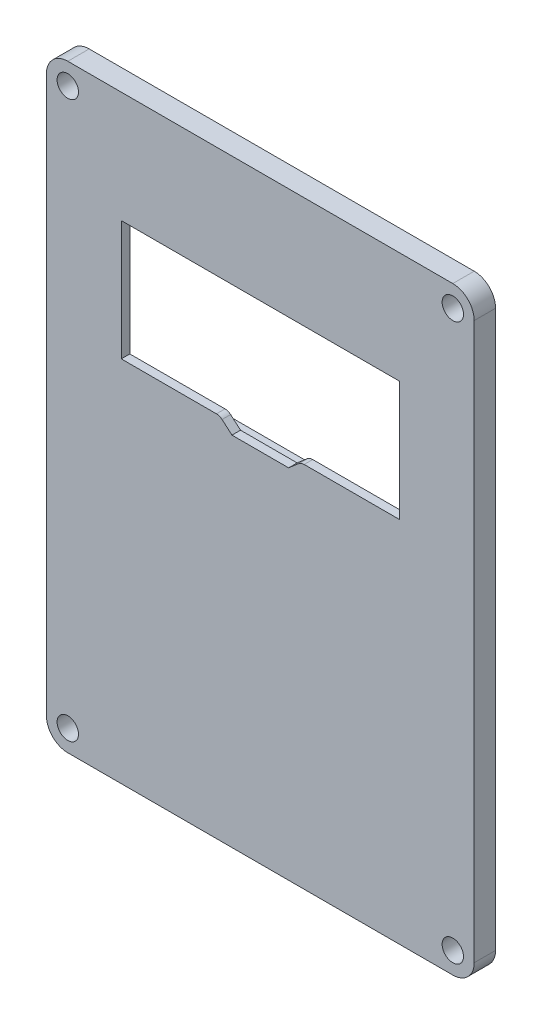
ISO-10303-21;
HEADER;
FILE_DESCRIPTION(('STEP AP214'),'2;1');
FILE_NAME('part.step','',(''),(''),'','','');
FILE_SCHEMA(('AUTOMOTIVE_DESIGN { 1 0 10303 214 1 1 1 1 }'));
ENDSEC;
DATA;
#1=APPLICATION_CONTEXT('core data for automotive mechanical design processes');
#2=APPLICATION_PROTOCOL_DEFINITION('international standard','automotive_design',2000,#1);
#3=PRODUCT_CONTEXT('',#1,'mechanical');
#4=PRODUCT('Part','Part','',(#3));
#5=PRODUCT_RELATED_PRODUCT_CATEGORY('part','',(#4));
#6=PRODUCT_DEFINITION_FORMATION('','',#4);
#7=PRODUCT_DEFINITION_CONTEXT('part definition',#1,'design');
#8=PRODUCT_DEFINITION('design','',#6,#7);
#9=PRODUCT_DEFINITION_SHAPE('','',#8);
#10=(LENGTH_UNIT() NAMED_UNIT(*) SI_UNIT(.MILLI.,.METRE.));
#11=(NAMED_UNIT(*) PLANE_ANGLE_UNIT() SI_UNIT($,.RADIAN.));
#12=(NAMED_UNIT(*) SI_UNIT($,.STERADIAN.) SOLID_ANGLE_UNIT());
#13=UNCERTAINTY_MEASURE_WITH_UNIT(LENGTH_MEASURE(1.E-05),#10,'distance_accuracy_value','');
#14=(GEOMETRIC_REPRESENTATION_CONTEXT(3) GLOBAL_UNCERTAINTY_ASSIGNED_CONTEXT((#13)) GLOBAL_UNIT_ASSIGNED_CONTEXT((#10,
#11,#12)) REPRESENTATION_CONTEXT('',''));
#15=CARTESIAN_POINT('',(0.,0.,0.));
#16=DIRECTION('',(0.,0.,1.));
#17=DIRECTION('',(1.,0.,0.));
#18=AXIS2_PLACEMENT_3D('',#15,#16,#17);
#19=CARTESIAN_POINT('',(0.,0.,5.));
#20=DIRECTION('',(0.,0.,1.));
#21=DIRECTION('',(1.,0.,0.));
#22=AXIS2_PLACEMENT_3D('',#19,#20,#21);
#23=PLANE('',#22);
#24=CARTESIAN_POINT('',(-45.,-65.,5.));
#25=DIRECTION('',(0.,0.,1.));
#26=DIRECTION('',(1.,0.,0.));
#27=AXIS2_PLACEMENT_3D('',#24,#25,#26);
#28=CIRCLE('',#27,2.5);
#29=CARTESIAN_POINT('',(-42.5,-65.,5.));
#30=VERTEX_POINT('',#29);
#31=EDGE_CURVE('E218',#30,#30,#28,.T.);
#32=ORIENTED_EDGE('',*,*,#31,.F.);
#33=EDGE_LOOP('',(#32));
#34=FACE_BOUND('',#33,.T.);
#35=CARTESIAN_POINT('',(45.,-65.,5.));
#36=DIRECTION('',(0.,0.,1.));
#37=DIRECTION('',(1.,0.,0.));
#38=AXIS2_PLACEMENT_3D('',#35,#36,#37);
#39=CIRCLE('',#38,2.5);
#40=CARTESIAN_POINT('',(47.5,-65.,5.));
#41=VERTEX_POINT('',#40);
#42=EDGE_CURVE('E221',#41,#41,#39,.T.);
#43=ORIENTED_EDGE('',*,*,#42,.F.);
#44=EDGE_LOOP('',(#43));
#45=FACE_BOUND('',#44,.T.);
#46=CARTESIAN_POINT('',(45.,65.,5.));
#47=DIRECTION('',(0.,0.,1.));
#48=DIRECTION('',(1.,0.,0.));
#49=AXIS2_PLACEMENT_3D('',#46,#47,#48);
#50=CIRCLE('',#49,2.5);
#51=CARTESIAN_POINT('',(47.5,65.,5.));
#52=VERTEX_POINT('',#51);
#53=EDGE_CURVE('E225',#52,#52,#50,.T.);
#54=ORIENTED_EDGE('',*,*,#53,.F.);
#55=EDGE_LOOP('',(#54));
#56=FACE_BOUND('',#55,.T.);
#57=CARTESIAN_POINT('',(-45.,65.,5.));
#58=DIRECTION('',(0.,0.,1.));
#59=DIRECTION('',(1.,0.,0.));
#60=AXIS2_PLACEMENT_3D('',#57,#58,#59);
#61=CIRCLE('',#60,2.5);
#62=CARTESIAN_POINT('',(-42.5,65.,5.));
#63=VERTEX_POINT('',#62);
#64=EDGE_CURVE('E228',#63,#63,#61,.T.);
#65=ORIENTED_EDGE('',*,*,#64,.F.);
#66=EDGE_LOOP('',(#65));
#67=FACE_BOUND('',#66,.T.);
#68=DIRECTION('',(1.,0.,0.));
#69=VECTOR('',#68,1.);
#70=CARTESIAN_POINT('',(0.,70.,5.));
#71=LINE('',#70,#69);
#72=CARTESIAN_POINT('',(-45.,70.,5.));
#73=VERTEX_POINT('',#72);
#74=CARTESIAN_POINT('',(45.,70.,5.));
#75=VERTEX_POINT('',#74);
#76=EDGE_CURVE('E231',#73,#75,#71,.T.);
#77=ORIENTED_EDGE('',*,*,#76,.F.);
#78=CARTESIAN_POINT('',(-45.,65.,5.));
#79=DIRECTION('',(0.,0.,1.));
#80=DIRECTION('',(1.,0.,0.));
#81=AXIS2_PLACEMENT_3D('',#78,#79,#80);
#82=CIRCLE('',#81,5.00000000000001);
#83=CARTESIAN_POINT('',(-50.,65.,5.));
#84=VERTEX_POINT('',#83);
#85=EDGE_CURVE('E234',#73,#84,#82,.T.);
#86=ORIENTED_EDGE('',*,*,#85,.T.);
#87=DIRECTION('',(0.,-1.,0.));
#88=VECTOR('',#87,1.);
#89=CARTESIAN_POINT('',(-50.,0.,5.));
#90=LINE('',#89,#88);
#91=CARTESIAN_POINT('',(-50.,-65.,5.));
#92=VERTEX_POINT('',#91);
#93=EDGE_CURVE('E237',#84,#92,#90,.T.);
#94=ORIENTED_EDGE('',*,*,#93,.T.);
#95=CARTESIAN_POINT('',(-45.,-65.,5.));
#96=DIRECTION('',(0.,0.,1.));
#97=DIRECTION('',(1.,0.,0.));
#98=AXIS2_PLACEMENT_3D('',#95,#96,#97);
#99=CIRCLE('',#98,5.);
#100=CARTESIAN_POINT('',(-45.,-70.,5.));
#101=VERTEX_POINT('',#100);
#102=EDGE_CURVE('E240',#92,#101,#99,.T.);
#103=ORIENTED_EDGE('',*,*,#102,.T.);
#104=DIRECTION('',(1.,0.,0.));
#105=VECTOR('',#104,1.);
#106=CARTESIAN_POINT('',(0.,-70.,5.));
#107=LINE('',#106,#105);
#108=CARTESIAN_POINT('',(45.,-70.,5.));
#109=VERTEX_POINT('',#108);
#110=EDGE_CURVE('E243',#101,#109,#107,.T.);
#111=ORIENTED_EDGE('',*,*,#110,.T.);
#112=CARTESIAN_POINT('',(45.,-65.,5.));
#113=DIRECTION('',(0.,0.,1.));
#114=DIRECTION('',(1.,0.,0.));
#115=AXIS2_PLACEMENT_3D('',#112,#113,#114);
#116=CIRCLE('',#115,4.99999999999999);
#117=CARTESIAN_POINT('',(50.,-65.,5.));
#118=VERTEX_POINT('',#117);
#119=EDGE_CURVE('E246',#109,#118,#116,.T.);
#120=ORIENTED_EDGE('',*,*,#119,.T.);
#121=DIRECTION('',(0.,-1.,0.));
#122=VECTOR('',#121,1.);
#123=CARTESIAN_POINT('',(50.,0.,5.));
#124=LINE('',#123,#122);
#125=CARTESIAN_POINT('',(50.,65.,5.));
#126=VERTEX_POINT('',#125);
#127=EDGE_CURVE('E248',#126,#118,#124,.T.);
#128=ORIENTED_EDGE('',*,*,#127,.F.);
#129=CARTESIAN_POINT('',(45.,65.,5.));
#130=DIRECTION('',(0.,0.,1.));
#131=DIRECTION('',(1.,0.,0.));
#132=AXIS2_PLACEMENT_3D('',#129,#130,#131);
#133=CIRCLE('',#132,5.);
#134=EDGE_CURVE('E251',#75,#126,#133,.F.);
#135=ORIENTED_EDGE('',*,*,#134,.F.);
#136=EDGE_LOOP('',(#77,#86,#94,#103,#111,#120,#128,#135));
#137=FACE_BOUND('',#136,.T.);
#138=DIRECTION('',(0.754953355153231,-0.655778492741932,0.));
#139=VECTOR('',#138,1.);
#140=CARTESIAN_POINT('',(3.83588317366824,4.41599244865184,5.));
#141=LINE('',#140,#139);
#142=CARTESIAN_POINT('',(-8.93578879532143,15.5099067103065,5.));
#143=VERTEX_POINT('',#142);
#144=CARTESIAN_POINT('',(-6.6219193542143,13.5,5.));
#145=VERTEX_POINT('',#144);
#146=EDGE_CURVE('E217',#143,#145,#141,.T.);
#147=ORIENTED_EDGE('',*,*,#146,.F.);
#148=CARTESIAN_POINT('',(-10.2473457808053,14.,5.));
#149=DIRECTION('',(0.,0.,-1.));
#150=DIRECTION('',(-1.,0.,0.));
#151=AXIS2_PLACEMENT_3D('',#148,#149,#150);
#152=CIRCLE('',#151,2.);
#153=CARTESIAN_POINT('',(-10.2473457808053,16.,5.));
#154=VERTEX_POINT('',#153);
#155=EDGE_CURVE('E346',#154,#143,#152,.T.);
#156=ORIENTED_EDGE('',*,*,#155,.F.);
#157=DIRECTION('',(1.,0.,0.));
#158=VECTOR('',#157,1.);
#159=CARTESIAN_POINT('',(0.,16.,5.));
#160=LINE('',#159,#158);
#161=CARTESIAN_POINT('',(-32.5,16.,5.));
#162=VERTEX_POINT('',#161);
#163=EDGE_CURVE('E434',#162,#154,#160,.T.);
#164=ORIENTED_EDGE('',*,*,#163,.F.);
#165=DIRECTION('',(0.,1.,0.));
#166=VECTOR('',#165,1.);
#167=CARTESIAN_POINT('',(-32.5,0.,5.));
#168=LINE('',#167,#166);
#169=CARTESIAN_POINT('',(-32.5,44.,5.));
#170=VERTEX_POINT('',#169);
#171=EDGE_CURVE('E436',#162,#170,#168,.T.);
#172=ORIENTED_EDGE('',*,*,#171,.T.);
#173=DIRECTION('',(-1.,0.,0.));
#174=VECTOR('',#173,1.);
#175=CARTESIAN_POINT('',(0.,44.,5.));
#176=LINE('',#175,#174);
#177=CARTESIAN_POINT('',(32.5,44.,5.));
#178=VERTEX_POINT('',#177);
#179=EDGE_CURVE('E206',#178,#170,#176,.T.);
#180=ORIENTED_EDGE('',*,*,#179,.F.);
#181=DIRECTION('',(0.,1.,0.));
#182=VECTOR('',#181,1.);
#183=CARTESIAN_POINT('',(32.5,0.,5.));
#184=LINE('',#183,#182);
#185=CARTESIAN_POINT('',(32.5,16.,5.));
#186=VERTEX_POINT('',#185);
#187=EDGE_CURVE('E382',#186,#178,#184,.T.);
#188=ORIENTED_EDGE('',*,*,#187,.F.);
#189=DIRECTION('',(-1.,0.,0.));
#190=VECTOR('',#189,1.);
#191=CARTESIAN_POINT('',(0.,16.,5.));
#192=LINE('',#191,#190);
#193=CARTESIAN_POINT('',(10.2473457808053,16.,5.));
#194=VERTEX_POINT('',#193);
#195=EDGE_CURVE('E378',#186,#194,#192,.T.);
#196=ORIENTED_EDGE('',*,*,#195,.T.);
#197=CARTESIAN_POINT('',(10.2473457808053,14.,5.));
#198=DIRECTION('',(0.,0.,-1.));
#199=DIRECTION('',(-1.,0.,0.));
#200=AXIS2_PLACEMENT_3D('',#197,#198,#199);
#201=CIRCLE('',#200,2.);
#202=CARTESIAN_POINT('',(8.93578879532143,15.5099067103065,5.));
#203=VERTEX_POINT('',#202);
#204=EDGE_CURVE('E441',#194,#203,#201,.F.);
#205=ORIENTED_EDGE('',*,*,#204,.T.);
#206=DIRECTION('',(-0.754953355153231,-0.655778492741932,0.));
#207=VECTOR('',#206,1.);
#208=CARTESIAN_POINT('',(-3.83588317366824,4.41599244865184,5.));
#209=LINE('',#208,#207);
#210=CARTESIAN_POINT('',(6.6219193542143,13.5,5.));
#211=VERTEX_POINT('',#210);
#212=EDGE_CURVE('E355',#203,#211,#209,.T.);
#213=ORIENTED_EDGE('',*,*,#212,.T.);
#214=DIRECTION('',(-1.,0.,0.));
#215=VECTOR('',#214,1.);
#216=CARTESIAN_POINT('',(0.,13.5,5.));
#217=LINE('',#216,#215);
#218=EDGE_CURVE('E349',#211,#145,#217,.T.);
#219=ORIENTED_EDGE('',*,*,#218,.T.);
#220=EDGE_LOOP('',(#147,#156,#164,#172,#180,#188,#196,#205,#213,#219));
#221=FACE_BOUND('',#220,.T.);
#222=ADVANCED_FACE('F39',(#34,#45,#56,#67,#137,#221),#23,.T.);
#223=CARTESIAN_POINT('',(0.,0.,0.));
#224=DIRECTION('',(0.,0.,1.));
#225=DIRECTION('',(1.,0.,0.));
#226=AXIS2_PLACEMENT_3D('',#223,#224,#225);
#227=PLANE('',#226);
#228=DIRECTION('',(1.,0.,0.));
#229=VECTOR('',#228,1.);
#230=CARTESIAN_POINT('',(38.,48.,0.));
#231=LINE('',#230,#229);
#232=CARTESIAN_POINT('',(-38.,48.,0.));
#233=VERTEX_POINT('',#232);
#234=CARTESIAN_POINT('',(38.,48.,0.));
#235=VERTEX_POINT('',#234);
#236=EDGE_CURVE('E418',#233,#235,#231,.T.);
#237=ORIENTED_EDGE('',*,*,#236,.F.);
#238=DIRECTION('',(0.,1.,0.));
#239=VECTOR('',#238,1.);
#240=CARTESIAN_POINT('',(-38.,12.,0.));
#241=LINE('',#240,#239);
#242=CARTESIAN_POINT('',(-38.,12.,0.));
#243=VERTEX_POINT('',#242);
#244=EDGE_CURVE('E54',#243,#233,#241,.T.);
#245=ORIENTED_EDGE('',*,*,#244,.F.);
#246=DIRECTION('',(-1.,0.,0.));
#247=VECTOR('',#246,1.);
#248=CARTESIAN_POINT('',(38.,12.,0.));
#249=LINE('',#248,#247);
#250=CARTESIAN_POINT('',(38.,12.,0.));
#251=VERTEX_POINT('',#250);
#252=EDGE_CURVE('E407',#251,#243,#249,.T.);
#253=ORIENTED_EDGE('',*,*,#252,.F.);
#254=DIRECTION('',(0.,-1.,0.));
#255=VECTOR('',#254,1.);
#256=CARTESIAN_POINT('',(38.,12.,0.));
#257=LINE('',#256,#255);
#258=EDGE_CURVE('E421',#235,#251,#257,.T.);
#259=ORIENTED_EDGE('',*,*,#258,.F.);
#260=EDGE_LOOP('',(#237,#245,#253,#259));
#261=FACE_BOUND('',#260,.T.);
#262=DIRECTION('',(1.,0.,0.));
#263=VECTOR('',#262,1.);
#264=CARTESIAN_POINT('',(0.,70.,0.));
#265=LINE('',#264,#263);
#266=CARTESIAN_POINT('',(-45.,70.,0.));
#267=VERTEX_POINT('',#266);
#268=CARTESIAN_POINT('',(45.,70.,0.));
#269=VERTEX_POINT('',#268);
#270=EDGE_CURVE('E268',#267,#269,#265,.T.);
#271=ORIENTED_EDGE('',*,*,#270,.T.);
#272=CARTESIAN_POINT('',(45.,65.,0.));
#273=DIRECTION('',(0.,0.,1.));
#274=DIRECTION('',(1.,0.,0.));
#275=AXIS2_PLACEMENT_3D('',#272,#273,#274);
#276=CIRCLE('',#275,5.);
#277=CARTESIAN_POINT('',(50.,65.,0.));
#278=VERTEX_POINT('',#277);
#279=EDGE_CURVE('E222',#269,#278,#276,.F.);
#280=ORIENTED_EDGE('',*,*,#279,.T.);
#281=DIRECTION('',(0.,-1.,0.));
#282=VECTOR('',#281,1.);
#283=CARTESIAN_POINT('',(50.,0.,0.));
#284=LINE('',#283,#282);
#285=CARTESIAN_POINT('',(50.,-65.,0.));
#286=VERTEX_POINT('',#285);
#287=EDGE_CURVE('E286',#278,#286,#284,.T.);
#288=ORIENTED_EDGE('',*,*,#287,.T.);
#289=CARTESIAN_POINT('',(45.,-65.,0.));
#290=DIRECTION('',(0.,0.,1.));
#291=DIRECTION('',(1.,0.,0.));
#292=AXIS2_PLACEMENT_3D('',#289,#290,#291);
#293=CIRCLE('',#292,4.99999999999999);
#294=CARTESIAN_POINT('',(45.,-70.,0.));
#295=VERTEX_POINT('',#294);
#296=EDGE_CURVE('E283',#295,#286,#293,.T.);
#297=ORIENTED_EDGE('',*,*,#296,.F.);
#298=DIRECTION('',(1.,0.,0.));
#299=VECTOR('',#298,1.);
#300=CARTESIAN_POINT('',(0.,-70.,0.));
#301=LINE('',#300,#299);
#302=CARTESIAN_POINT('',(-45.,-70.,0.));
#303=VERTEX_POINT('',#302);
#304=EDGE_CURVE('E280',#303,#295,#301,.T.);
#305=ORIENTED_EDGE('',*,*,#304,.F.);
#306=CARTESIAN_POINT('',(-45.,-65.,0.));
#307=DIRECTION('',(0.,0.,1.));
#308=DIRECTION('',(1.,0.,0.));
#309=AXIS2_PLACEMENT_3D('',#306,#307,#308);
#310=CIRCLE('',#309,5.);
#311=CARTESIAN_POINT('',(-50.,-65.,0.));
#312=VERTEX_POINT('',#311);
#313=EDGE_CURVE('E277',#312,#303,#310,.T.);
#314=ORIENTED_EDGE('',*,*,#313,.F.);
#315=DIRECTION('',(0.,-1.,0.));
#316=VECTOR('',#315,1.);
#317=CARTESIAN_POINT('',(-50.,0.,0.));
#318=LINE('',#317,#316);
#319=CARTESIAN_POINT('',(-50.,65.,0.));
#320=VERTEX_POINT('',#319);
#321=EDGE_CURVE('E274',#320,#312,#318,.T.);
#322=ORIENTED_EDGE('',*,*,#321,.F.);
#323=CARTESIAN_POINT('',(-45.,65.,0.));
#324=DIRECTION('',(0.,0.,1.));
#325=DIRECTION('',(1.,0.,0.));
#326=AXIS2_PLACEMENT_3D('',#323,#324,#325);
#327=CIRCLE('',#326,5.00000000000001);
#328=EDGE_CURVE('E271',#267,#320,#327,.T.);
#329=ORIENTED_EDGE('',*,*,#328,.F.);
#330=EDGE_LOOP('',(#271,#280,#288,#297,#305,#314,#322,#329));
#331=FACE_BOUND('',#330,.T.);
#332=CARTESIAN_POINT('',(-45.,65.,0.));
#333=DIRECTION('',(0.,0.,1.));
#334=DIRECTION('',(1.,0.,0.));
#335=AXIS2_PLACEMENT_3D('',#332,#333,#334);
#336=CIRCLE('',#335,2.5);
#337=CARTESIAN_POINT('',(-42.5,65.,0.));
#338=VERTEX_POINT('',#337);
#339=EDGE_CURVE('E265',#338,#338,#336,.T.);
#340=ORIENTED_EDGE('',*,*,#339,.T.);
#341=EDGE_LOOP('',(#340));
#342=FACE_BOUND('',#341,.T.);
#343=CARTESIAN_POINT('',(45.,65.,0.));
#344=DIRECTION('',(0.,0.,1.));
#345=DIRECTION('',(1.,0.,0.));
#346=AXIS2_PLACEMENT_3D('',#343,#344,#345);
#347=CIRCLE('',#346,2.5);
#348=CARTESIAN_POINT('',(47.5,65.,0.));
#349=VERTEX_POINT('',#348);
#350=EDGE_CURVE('E262',#349,#349,#347,.T.);
#351=ORIENTED_EDGE('',*,*,#350,.T.);
#352=EDGE_LOOP('',(#351));
#353=FACE_BOUND('',#352,.T.);
#354=CARTESIAN_POINT('',(45.,-65.,0.));
#355=DIRECTION('',(0.,0.,1.));
#356=DIRECTION('',(1.,0.,0.));
#357=AXIS2_PLACEMENT_3D('',#354,#355,#356);
#358=CIRCLE('',#357,2.5);
#359=CARTESIAN_POINT('',(47.5,-65.,0.));
#360=VERTEX_POINT('',#359);
#361=EDGE_CURVE('E258',#360,#360,#358,.T.);
#362=ORIENTED_EDGE('',*,*,#361,.T.);
#363=EDGE_LOOP('',(#362));
#364=FACE_BOUND('',#363,.T.);
#365=CARTESIAN_POINT('',(-45.,-65.,0.));
#366=DIRECTION('',(0.,0.,1.));
#367=DIRECTION('',(1.,0.,0.));
#368=AXIS2_PLACEMENT_3D('',#365,#366,#367);
#369=CIRCLE('',#368,2.5);
#370=CARTESIAN_POINT('',(-42.5,-65.,0.));
#371=VERTEX_POINT('',#370);
#372=EDGE_CURVE('E255',#371,#371,#369,.T.);
#373=ORIENTED_EDGE('',*,*,#372,.T.);
#374=EDGE_LOOP('',(#373));
#375=FACE_BOUND('',#374,.T.);
#376=ADVANCED_FACE('F315',(#261,#331,#342,#353,#364,#375),#227,.F.);
#377=CARTESIAN_POINT('',(0.,70.,5.));
#378=DIRECTION('',(0.,1.,0.));
#379=DIRECTION('',(0.,0.,1.));
#380=AXIS2_PLACEMENT_3D('',#377,#378,#379);
#381=PLANE('',#380);
#382=ORIENTED_EDGE('',*,*,#270,.F.);
#383=DIRECTION('',(0.,0.,-1.));
#384=VECTOR('',#383,1.);
#385=CARTESIAN_POINT('',(-45.,70.,5.));
#386=LINE('',#385,#384);
#387=EDGE_CURVE('E11',#73,#267,#386,.T.);
#388=ORIENTED_EDGE('',*,*,#387,.F.);
#389=ORIENTED_EDGE('',*,*,#76,.T.);
#390=DIRECTION('',(0.,0.,-1.));
#391=VECTOR('',#390,1.);
#392=CARTESIAN_POINT('',(45.,70.,5.));
#393=LINE('',#392,#391);
#394=EDGE_CURVE('E254',#75,#269,#393,.T.);
#395=ORIENTED_EDGE('',*,*,#394,.T.);
#396=EDGE_LOOP('',(#382,#388,#389,#395));
#397=FACE_BOUND('',#396,.T.);
#398=ADVANCED_FACE('F319',(#397),#381,.T.);
#399=CARTESIAN_POINT('',(-45.,65.,5.));
#400=DIRECTION('',(0.,0.,-1.));
#401=DIRECTION('',(-1.,0.,0.));
#402=AXIS2_PLACEMENT_3D('',#399,#400,#401);
#403=CYLINDRICAL_SURFACE('',#402,5.00000000000001);
#404=ORIENTED_EDGE('',*,*,#328,.T.);
#405=DIRECTION('',(0.,0.,-1.));
#406=VECTOR('',#405,1.);
#407=CARTESIAN_POINT('',(-50.,65.,5.));
#408=LINE('',#407,#406);
#409=EDGE_CURVE('E47',#84,#320,#408,.T.);
#410=ORIENTED_EDGE('',*,*,#409,.F.);
#411=ORIENTED_EDGE('',*,*,#85,.F.);
#412=ORIENTED_EDGE('',*,*,#387,.T.);
#413=EDGE_LOOP('',(#404,#410,#411,#412));
#414=FACE_BOUND('',#413,.T.);
#415=ADVANCED_FACE('F312',(#414),#403,.T.);
#416=CARTESIAN_POINT('',(-50.,0.,5.));
#417=DIRECTION('',(1.,0.,0.));
#418=DIRECTION('',(0.,1.,0.));
#419=AXIS2_PLACEMENT_3D('',#416,#417,#418);
#420=PLANE('',#419);
#421=ORIENTED_EDGE('',*,*,#321,.T.);
#422=DIRECTION('',(0.,0.,-1.));
#423=VECTOR('',#422,1.);
#424=CARTESIAN_POINT('',(-50.,-65.,5.));
#425=LINE('',#424,#423);
#426=EDGE_CURVE('E302',#92,#312,#425,.T.);
#427=ORIENTED_EDGE('',*,*,#426,.F.);
#428=ORIENTED_EDGE('',*,*,#93,.F.);
#429=ORIENTED_EDGE('',*,*,#409,.T.);
#430=EDGE_LOOP('',(#421,#427,#428,#429));
#431=FACE_BOUND('',#430,.T.);
#432=ADVANCED_FACE('F307',(#431),#420,.F.);
#433=CARTESIAN_POINT('',(-45.,-65.,5.));
#434=DIRECTION('',(0.,0.,-1.));
#435=DIRECTION('',(-1.,0.,0.));
#436=AXIS2_PLACEMENT_3D('',#433,#434,#435);
#437=CYLINDRICAL_SURFACE('',#436,5.);
#438=ORIENTED_EDGE('',*,*,#313,.T.);
#439=DIRECTION('',(0.,0.,-1.));
#440=VECTOR('',#439,1.);
#441=CARTESIAN_POINT('',(-45.,-70.,5.));
#442=LINE('',#441,#440);
#443=EDGE_CURVE('E299',#101,#303,#442,.T.);
#444=ORIENTED_EDGE('',*,*,#443,.F.);
#445=ORIENTED_EDGE('',*,*,#102,.F.);
#446=ORIENTED_EDGE('',*,*,#426,.T.);
#447=EDGE_LOOP('',(#438,#444,#445,#446));
#448=FACE_BOUND('',#447,.T.);
#449=ADVANCED_FACE('F336',(#448),#437,.T.);
#450=CARTESIAN_POINT('',(0.,-70.,5.));
#451=DIRECTION('',(0.,1.,0.));
#452=DIRECTION('',(0.,0.,1.));
#453=AXIS2_PLACEMENT_3D('',#450,#451,#452);
#454=PLANE('',#453);
#455=ORIENTED_EDGE('',*,*,#304,.T.);
#456=DIRECTION('',(0.,0.,-1.));
#457=VECTOR('',#456,1.);
#458=CARTESIAN_POINT('',(45.,-70.,5.));
#459=LINE('',#458,#457);
#460=EDGE_CURVE('E296',#109,#295,#459,.T.);
#461=ORIENTED_EDGE('',*,*,#460,.F.);
#462=ORIENTED_EDGE('',*,*,#110,.F.);
#463=ORIENTED_EDGE('',*,*,#443,.T.);
#464=EDGE_LOOP('',(#455,#461,#462,#463));
#465=FACE_BOUND('',#464,.T.);
#466=ADVANCED_FACE('F333',(#465),#454,.F.);
#467=CARTESIAN_POINT('',(45.,-65.,5.));
#468=DIRECTION('',(0.,0.,-1.));
#469=DIRECTION('',(-1.,0.,0.));
#470=AXIS2_PLACEMENT_3D('',#467,#468,#469);
#471=CYLINDRICAL_SURFACE('',#470,4.99999999999999);
#472=ORIENTED_EDGE('',*,*,#296,.T.);
#473=DIRECTION('',(0.,0.,-1.));
#474=VECTOR('',#473,1.);
#475=CARTESIAN_POINT('',(50.,-65.,5.));
#476=LINE('',#475,#474);
#477=EDGE_CURVE('E294',#118,#286,#476,.T.);
#478=ORIENTED_EDGE('',*,*,#477,.F.);
#479=ORIENTED_EDGE('',*,*,#119,.F.);
#480=ORIENTED_EDGE('',*,*,#460,.T.);
#481=EDGE_LOOP('',(#472,#478,#479,#480));
#482=FACE_BOUND('',#481,.T.);
#483=ADVANCED_FACE('F330',(#482),#471,.T.);
#484=CARTESIAN_POINT('',(50.,0.,5.));
#485=DIRECTION('',(1.,0.,0.));
#486=DIRECTION('',(0.,1.,0.));
#487=AXIS2_PLACEMENT_3D('',#484,#485,#486);
#488=PLANE('',#487);
#489=ORIENTED_EDGE('',*,*,#287,.F.);
#490=DIRECTION('',(0.,0.,-1.));
#491=VECTOR('',#490,1.);
#492=CARTESIAN_POINT('',(50.,65.,5.));
#493=LINE('',#492,#491);
#494=EDGE_CURVE('E292',#126,#278,#493,.T.);
#495=ORIENTED_EDGE('',*,*,#494,.F.);
#496=ORIENTED_EDGE('',*,*,#127,.T.);
#497=ORIENTED_EDGE('',*,*,#477,.T.);
#498=EDGE_LOOP('',(#489,#495,#496,#497));
#499=FACE_BOUND('',#498,.T.);
#500=ADVANCED_FACE('F326',(#499),#488,.T.);
#501=CARTESIAN_POINT('',(-45.,65.,5.));
#502=DIRECTION('',(0.,0.,-1.));
#503=DIRECTION('',(-1.,0.,0.));
#504=AXIS2_PLACEMENT_3D('',#501,#502,#503);
#505=CYLINDRICAL_SURFACE('',#504,2.5);
#506=ORIENTED_EDGE('',*,*,#64,.T.);
#507=EDGE_LOOP('',(#506));
#508=FACE_BOUND('',#507,.T.);
#509=ORIENTED_EDGE('',*,*,#339,.F.);
#510=EDGE_LOOP('',(#509));
#511=FACE_BOUND('',#510,.T.);
#512=ADVANCED_FACE('F476',(#508,#511),#505,.F.);
#513=CARTESIAN_POINT('',(45.,65.,5.));
#514=DIRECTION('',(0.,0.,-1.));
#515=DIRECTION('',(-1.,0.,0.));
#516=AXIS2_PLACEMENT_3D('',#513,#514,#515);
#517=CYLINDRICAL_SURFACE('',#516,2.5);
#518=ORIENTED_EDGE('',*,*,#53,.T.);
#519=EDGE_LOOP('',(#518));
#520=FACE_BOUND('',#519,.T.);
#521=ORIENTED_EDGE('',*,*,#350,.F.);
#522=EDGE_LOOP('',(#521));
#523=FACE_BOUND('',#522,.T.);
#524=ADVANCED_FACE('F491',(#520,#523),#517,.F.);
#525=CARTESIAN_POINT('',(45.,-65.,5.));
#526=DIRECTION('',(0.,0.,-1.));
#527=DIRECTION('',(-1.,0.,0.));
#528=AXIS2_PLACEMENT_3D('',#525,#526,#527);
#529=CYLINDRICAL_SURFACE('',#528,2.5);
#530=ORIENTED_EDGE('',*,*,#42,.T.);
#531=EDGE_LOOP('',(#530));
#532=FACE_BOUND('',#531,.T.);
#533=ORIENTED_EDGE('',*,*,#361,.F.);
#534=EDGE_LOOP('',(#533));
#535=FACE_BOUND('',#534,.T.);
#536=ADVANCED_FACE('F494',(#532,#535),#529,.F.);
#537=CARTESIAN_POINT('',(-45.,-65.,5.));
#538=DIRECTION('',(0.,0.,-1.));
#539=DIRECTION('',(-1.,0.,0.));
#540=AXIS2_PLACEMENT_3D('',#537,#538,#539);
#541=CYLINDRICAL_SURFACE('',#540,2.5);
#542=ORIENTED_EDGE('',*,*,#31,.T.);
#543=EDGE_LOOP('',(#542));
#544=FACE_BOUND('',#543,.T.);
#545=ORIENTED_EDGE('',*,*,#372,.F.);
#546=EDGE_LOOP('',(#545));
#547=FACE_BOUND('',#546,.T.);
#548=ADVANCED_FACE('F41',(#544,#547),#541,.F.);
#549=CARTESIAN_POINT('',(45.,65.,5.));
#550=DIRECTION('',(0.,0.,-1.));
#551=DIRECTION('',(-1.,0.,0.));
#552=AXIS2_PLACEMENT_3D('',#549,#550,#551);
#553=CYLINDRICAL_SURFACE('',#552,5.);
#554=ORIENTED_EDGE('',*,*,#279,.F.);
#555=ORIENTED_EDGE('',*,*,#394,.F.);
#556=ORIENTED_EDGE('',*,*,#134,.T.);
#557=ORIENTED_EDGE('',*,*,#494,.T.);
#558=EDGE_LOOP('',(#554,#555,#556,#557));
#559=FACE_BOUND('',#558,.T.);
#560=ADVANCED_FACE('F323',(#559),#553,.T.);
#561=CARTESIAN_POINT('',(-10.2473457808053,14.,5.));
#562=DIRECTION('',(0.,0.,-1.));
#563=DIRECTION('',(-1.,0.,0.));
#564=AXIS2_PLACEMENT_3D('',#561,#562,#563);
#565=CYLINDRICAL_SURFACE('',#564,2.);
#566=CARTESIAN_POINT('',(-10.2473457808053,14.,3.));
#567=DIRECTION('',(0.,0.,1.));
#568=DIRECTION('',(-1.,0.,0.));
#569=AXIS2_PLACEMENT_3D('',#566,#567,#568);
#570=CIRCLE('',#569,2.);
#571=CARTESIAN_POINT('',(-8.93578879532143,15.5099067103065,3.));
#572=VERTEX_POINT('',#571);
#573=CARTESIAN_POINT('',(-10.2473457808053,16.,3.));
#574=VERTEX_POINT('',#573);
#575=EDGE_CURVE('E398',#572,#574,#570,.T.);
#576=ORIENTED_EDGE('',*,*,#575,.T.);
#577=DIRECTION('',(0.,0.,-1.));
#578=VECTOR('',#577,1.);
#579=CARTESIAN_POINT('',(-10.2473457808053,16.,5.));
#580=LINE('',#579,#578);
#581=EDGE_CURVE('E211',#154,#574,#580,.T.);
#582=ORIENTED_EDGE('',*,*,#581,.F.);
#583=ORIENTED_EDGE('',*,*,#155,.T.);
#584=DIRECTION('',(0.,0.,-1.));
#585=VECTOR('',#584,1.);
#586=CARTESIAN_POINT('',(-8.93578879532143,15.5099067103065,5.));
#587=LINE('',#586,#585);
#588=EDGE_CURVE('E259',#143,#572,#587,.T.);
#589=ORIENTED_EDGE('',*,*,#588,.T.);
#590=EDGE_LOOP('',(#576,#582,#583,#589));
#591=FACE_BOUND('',#590,.T.);
#592=ADVANCED_FACE('F451',(#591),#565,.T.);
#593=CARTESIAN_POINT('',(3.83588317366824,4.41599244865184,5.));
#594=DIRECTION('',(0.655778492741932,0.754953355153231,0.));
#595=DIRECTION('',(-0.754953355153231,0.655778492741932,0.));
#596=AXIS2_PLACEMENT_3D('',#593,#594,#595);
#597=PLANE('',#596);
#598=DIRECTION('',(-0.754953355153231,0.655778492741932,0.));
#599=VECTOR('',#598,1.);
#600=CARTESIAN_POINT('',(-8.93578879532143,15.5099067103065,3.));
#601=LINE('',#600,#599);
#602=CARTESIAN_POINT('',(-6.6219193542143,13.5,3.));
#603=VERTEX_POINT('',#602);
#604=EDGE_CURVE('E395',#603,#572,#601,.T.);
#605=ORIENTED_EDGE('',*,*,#604,.T.);
#606=ORIENTED_EDGE('',*,*,#588,.F.);
#607=ORIENTED_EDGE('',*,*,#146,.T.);
#608=DIRECTION('',(0.,0.,-1.));
#609=VECTOR('',#608,1.);
#610=CARTESIAN_POINT('',(-6.6219193542143,13.5,5.));
#611=LINE('',#610,#609);
#612=EDGE_CURVE('E361',#145,#603,#611,.T.);
#613=ORIENTED_EDGE('',*,*,#612,.T.);
#614=EDGE_LOOP('',(#605,#606,#607,#613));
#615=FACE_BOUND('',#614,.T.);
#616=ADVANCED_FACE('F449',(#615),#597,.T.);
#617=CARTESIAN_POINT('',(0.,13.5,5.));
#618=DIRECTION('',(0.,-1.,0.));
#619=DIRECTION('',(0.,0.,-1.));
#620=AXIS2_PLACEMENT_3D('',#617,#618,#619);
#621=PLANE('',#620);
#622=DIRECTION('',(0.,0.,-1.));
#623=VECTOR('',#622,1.);
#624=CARTESIAN_POINT('',(6.6219193542143,13.5,5.));
#625=LINE('',#624,#623);
#626=CARTESIAN_POINT('',(6.6219193542143,13.5,3.));
#627=VERTEX_POINT('',#626);
#628=EDGE_CURVE('E363',#211,#627,#625,.T.);
#629=ORIENTED_EDGE('',*,*,#628,.T.);
#630=DIRECTION('',(-1.,0.,0.));
#631=VECTOR('',#630,1.);
#632=CARTESIAN_POINT('',(6.6219193542143,13.5,3.));
#633=LINE('',#632,#631);
#634=EDGE_CURVE('E392',#627,#603,#633,.T.);
#635=ORIENTED_EDGE('',*,*,#634,.T.);
#636=ORIENTED_EDGE('',*,*,#612,.F.);
#637=ORIENTED_EDGE('',*,*,#218,.F.);
#638=EDGE_LOOP('',(#629,#635,#636,#637));
#639=FACE_BOUND('',#638,.T.);
#640=ADVANCED_FACE('F448',(#639),#621,.F.);
#641=CARTESIAN_POINT('',(-3.83588317366824,4.41599244865184,5.));
#642=DIRECTION('',(0.655778492741932,-0.754953355153231,0.));
#643=DIRECTION('',(0.754953355153231,0.655778492741932,0.));
#644=AXIS2_PLACEMENT_3D('',#641,#642,#643);
#645=PLANE('',#644);
#646=DIRECTION('',(0.,0.,-1.));
#647=VECTOR('',#646,1.);
#648=CARTESIAN_POINT('',(8.93578879532143,15.5099067103065,5.));
#649=LINE('',#648,#647);
#650=CARTESIAN_POINT('',(8.93578879532143,15.5099067103065,3.));
#651=VERTEX_POINT('',#650);
#652=EDGE_CURVE('E366',#203,#651,#649,.T.);
#653=ORIENTED_EDGE('',*,*,#652,.T.);
#654=DIRECTION('',(-0.754953355153231,-0.655778492741932,0.));
#655=VECTOR('',#654,1.);
#656=CARTESIAN_POINT('',(8.93578879532143,15.5099067103065,3.));
#657=LINE('',#656,#655);
#658=EDGE_CURVE('E389',#651,#627,#657,.T.);
#659=ORIENTED_EDGE('',*,*,#658,.T.);
#660=ORIENTED_EDGE('',*,*,#628,.F.);
#661=ORIENTED_EDGE('',*,*,#212,.F.);
#662=EDGE_LOOP('',(#653,#659,#660,#661));
#663=FACE_BOUND('',#662,.T.);
#664=ADVANCED_FACE('F446',(#663),#645,.F.);
#665=CARTESIAN_POINT('',(10.2473457808053,14.,5.));
#666=DIRECTION('',(0.,0.,-1.));
#667=DIRECTION('',(-1.,0.,0.));
#668=AXIS2_PLACEMENT_3D('',#665,#666,#667);
#669=CYLINDRICAL_SURFACE('',#668,2.);
#670=DIRECTION('',(0.,0.,-1.));
#671=VECTOR('',#670,1.);
#672=CARTESIAN_POINT('',(10.2473457808053,16.,5.));
#673=LINE('',#672,#671);
#674=CARTESIAN_POINT('',(10.2473457808053,16.,3.));
#675=VERTEX_POINT('',#674);
#676=EDGE_CURVE('E369',#194,#675,#673,.T.);
#677=ORIENTED_EDGE('',*,*,#676,.T.);
#678=CARTESIAN_POINT('',(10.2473457808053,14.,3.));
#679=DIRECTION('',(0.,0.,1.));
#680=DIRECTION('',(1.,0.,0.));
#681=AXIS2_PLACEMENT_3D('',#678,#679,#680);
#682=CIRCLE('',#681,2.);
#683=EDGE_CURVE('E384',#675,#651,#682,.T.);
#684=ORIENTED_EDGE('',*,*,#683,.T.);
#685=ORIENTED_EDGE('',*,*,#652,.F.);
#686=ORIENTED_EDGE('',*,*,#204,.F.);
#687=EDGE_LOOP('',(#677,#684,#685,#686));
#688=FACE_BOUND('',#687,.T.);
#689=ADVANCED_FACE('F562',(#688),#669,.T.);
#690=CARTESIAN_POINT('',(0.,16.,5.));
#691=DIRECTION('',(0.,-1.,0.));
#692=DIRECTION('',(0.,0.,-1.));
#693=AXIS2_PLACEMENT_3D('',#690,#691,#692);
#694=PLANE('',#693);
#695=DIRECTION('',(0.,0.,-1.));
#696=VECTOR('',#695,1.);
#697=CARTESIAN_POINT('',(32.5,16.,5.));
#698=LINE('',#697,#696);
#699=CARTESIAN_POINT('',(32.5,16.,3.));
#700=VERTEX_POINT('',#699);
#701=EDGE_CURVE('E209',#186,#700,#698,.T.);
#702=ORIENTED_EDGE('',*,*,#701,.T.);
#703=DIRECTION('',(-1.,0.,0.));
#704=VECTOR('',#703,1.);
#705=CARTESIAN_POINT('',(32.5,16.,3.));
#706=LINE('',#705,#704);
#707=EDGE_CURVE('E376',#700,#675,#706,.T.);
#708=ORIENTED_EDGE('',*,*,#707,.T.);
#709=ORIENTED_EDGE('',*,*,#676,.F.);
#710=ORIENTED_EDGE('',*,*,#195,.F.);
#711=EDGE_LOOP('',(#702,#708,#709,#710));
#712=FACE_BOUND('',#711,.T.);
#713=ADVANCED_FACE('F375',(#712),#694,.F.);
#714=CARTESIAN_POINT('',(32.5,0.,5.));
#715=DIRECTION('',(-1.,0.,0.));
#716=DIRECTION('',(0.,0.,1.));
#717=AXIS2_PLACEMENT_3D('',#714,#715,#716);
#718=PLANE('',#717);
#719=DIRECTION('',(0.,-1.,0.));
#720=VECTOR('',#719,1.);
#721=CARTESIAN_POINT('',(32.5,16.,3.));
#722=LINE('',#721,#720);
#723=CARTESIAN_POINT('',(32.5,44.,3.));
#724=VERTEX_POINT('',#723);
#725=EDGE_CURVE('E189',#724,#700,#722,.T.);
#726=ORIENTED_EDGE('',*,*,#725,.T.);
#727=ORIENTED_EDGE('',*,*,#701,.F.);
#728=ORIENTED_EDGE('',*,*,#187,.T.);
#729=DIRECTION('',(0.,0.,-1.));
#730=VECTOR('',#729,1.);
#731=CARTESIAN_POINT('',(32.5,44.,5.));
#732=LINE('',#731,#730);
#733=EDGE_CURVE('E207',#178,#724,#732,.T.);
#734=ORIENTED_EDGE('',*,*,#733,.T.);
#735=EDGE_LOOP('',(#726,#727,#728,#734));
#736=FACE_BOUND('',#735,.T.);
#737=ADVANCED_FACE('F381',(#736),#718,.T.);
#738=CARTESIAN_POINT('',(0.,44.,5.));
#739=DIRECTION('',(0.,-1.,0.));
#740=DIRECTION('',(0.,0.,-1.));
#741=AXIS2_PLACEMENT_3D('',#738,#739,#740);
#742=PLANE('',#741);
#743=DIRECTION('',(1.,0.,0.));
#744=VECTOR('',#743,1.);
#745=CARTESIAN_POINT('',(32.5,44.,3.));
#746=LINE('',#745,#744);
#747=CARTESIAN_POINT('',(-32.5,44.,3.));
#748=VERTEX_POINT('',#747);
#749=EDGE_CURVE('E185',#748,#724,#746,.T.);
#750=ORIENTED_EDGE('',*,*,#749,.T.);
#751=ORIENTED_EDGE('',*,*,#733,.F.);
#752=ORIENTED_EDGE('',*,*,#179,.T.);
#753=DIRECTION('',(0.,0.,-1.));
#754=VECTOR('',#753,1.);
#755=CARTESIAN_POINT('',(-32.5,44.,5.));
#756=LINE('',#755,#754);
#757=EDGE_CURVE('E199',#170,#748,#756,.T.);
#758=ORIENTED_EDGE('',*,*,#757,.T.);
#759=EDGE_LOOP('',(#750,#751,#752,#758));
#760=FACE_BOUND('',#759,.T.);
#761=ADVANCED_FACE('F204',(#760),#742,.T.);
#762=CARTESIAN_POINT('',(-32.5,0.,5.));
#763=DIRECTION('',(-1.,0.,0.));
#764=DIRECTION('',(0.,0.,1.));
#765=AXIS2_PLACEMENT_3D('',#762,#763,#764);
#766=PLANE('',#765);
#767=DIRECTION('',(0.,0.,-1.));
#768=VECTOR('',#767,1.);
#769=CARTESIAN_POINT('',(-32.5,16.,5.));
#770=LINE('',#769,#768);
#771=CARTESIAN_POINT('',(-32.5,16.,3.));
#772=VERTEX_POINT('',#771);
#773=EDGE_CURVE('E202',#162,#772,#770,.T.);
#774=ORIENTED_EDGE('',*,*,#773,.T.);
#775=DIRECTION('',(0.,1.,0.));
#776=VECTOR('',#775,1.);
#777=CARTESIAN_POINT('',(-32.5,16.,3.));
#778=LINE('',#777,#776);
#779=EDGE_CURVE('E62',#772,#748,#778,.T.);
#780=ORIENTED_EDGE('',*,*,#779,.T.);
#781=ORIENTED_EDGE('',*,*,#757,.F.);
#782=ORIENTED_EDGE('',*,*,#171,.F.);
#783=EDGE_LOOP('',(#774,#780,#781,#782));
#784=FACE_BOUND('',#783,.T.);
#785=ADVANCED_FACE('F198',(#784),#766,.F.);
#786=CARTESIAN_POINT('',(0.,16.,5.));
#787=DIRECTION('',(0.,1.,0.));
#788=DIRECTION('',(0.,0.,1.));
#789=AXIS2_PLACEMENT_3D('',#786,#787,#788);
#790=PLANE('',#789);
#791=DIRECTION('',(-1.,0.,0.));
#792=VECTOR('',#791,1.);
#793=CARTESIAN_POINT('',(-32.5,16.,3.));
#794=LINE('',#793,#792);
#795=EDGE_CURVE('E401',#574,#772,#794,.T.);
#796=ORIENTED_EDGE('',*,*,#795,.T.);
#797=ORIENTED_EDGE('',*,*,#773,.F.);
#798=ORIENTED_EDGE('',*,*,#163,.T.);
#799=ORIENTED_EDGE('',*,*,#581,.T.);
#800=EDGE_LOOP('',(#796,#797,#798,#799));
#801=FACE_BOUND('',#800,.T.);
#802=ADVANCED_FACE('F454',(#801),#790,.T.);
#803=CARTESIAN_POINT('',(-38.,12.,3.));
#804=DIRECTION('',(-1.,0.,0.));
#805=DIRECTION('',(0.,0.,1.));
#806=AXIS2_PLACEMENT_3D('',#803,#804,#805);
#807=PLANE('',#806);
#808=ORIENTED_EDGE('',*,*,#244,.T.);
#809=DIRECTION('',(0.,0.,-1.));
#810=VECTOR('',#809,1.);
#811=CARTESIAN_POINT('',(-38.,48.,3.));
#812=LINE('',#811,#810);
#813=CARTESIAN_POINT('',(-38.,48.,3.));
#814=VERTEX_POINT('',#813);
#815=EDGE_CURVE('E416',#814,#233,#812,.T.);
#816=ORIENTED_EDGE('',*,*,#815,.F.);
#817=DIRECTION('',(0.,1.,0.));
#818=VECTOR('',#817,1.);
#819=CARTESIAN_POINT('',(-38.,12.,3.));
#820=LINE('',#819,#818);
#821=CARTESIAN_POINT('',(-38.,12.,3.));
#822=VERTEX_POINT('',#821);
#823=EDGE_CURVE('E403',#822,#814,#820,.T.);
#824=ORIENTED_EDGE('',*,*,#823,.F.);
#825=DIRECTION('',(0.,0.,-1.));
#826=VECTOR('',#825,1.);
#827=CARTESIAN_POINT('',(-38.,12.,3.));
#828=LINE('',#827,#826);
#829=EDGE_CURVE('E426',#822,#243,#828,.T.);
#830=ORIENTED_EDGE('',*,*,#829,.T.);
#831=EDGE_LOOP('',(#808,#816,#824,#830));
#832=FACE_BOUND('',#831,.T.);
#833=ADVANCED_FACE('F456',(#832),#807,.F.);
#834=CARTESIAN_POINT('',(38.,12.,3.));
#835=DIRECTION('',(0.,-1.,0.));
#836=DIRECTION('',(0.,0.,-1.));
#837=AXIS2_PLACEMENT_3D('',#834,#835,#836);
#838=PLANE('',#837);
#839=ORIENTED_EDGE('',*,*,#252,.T.);
#840=ORIENTED_EDGE('',*,*,#829,.F.);
#841=DIRECTION('',(-1.,0.,0.));
#842=VECTOR('',#841,1.);
#843=CARTESIAN_POINT('',(38.,12.,3.));
#844=LINE('',#843,#842);
#845=CARTESIAN_POINT('',(38.,12.,3.));
#846=VERTEX_POINT('',#845);
#847=EDGE_CURVE('E413',#846,#822,#844,.T.);
#848=ORIENTED_EDGE('',*,*,#847,.F.);
#849=DIRECTION('',(0.,0.,-1.));
#850=VECTOR('',#849,1.);
#851=CARTESIAN_POINT('',(38.,12.,3.));
#852=LINE('',#851,#850);
#853=EDGE_CURVE('E428',#846,#251,#852,.T.);
#854=ORIENTED_EDGE('',*,*,#853,.T.);
#855=EDGE_LOOP('',(#839,#840,#848,#854));
#856=FACE_BOUND('',#855,.T.);
#857=ADVANCED_FACE('F462',(#856),#838,.F.);
#858=CARTESIAN_POINT('',(38.,12.,3.));
#859=DIRECTION('',(1.,0.,0.));
#860=DIRECTION('',(0.,0.,-1.));
#861=AXIS2_PLACEMENT_3D('',#858,#859,#860);
#862=PLANE('',#861);
#863=ORIENTED_EDGE('',*,*,#258,.T.);
#864=ORIENTED_EDGE('',*,*,#853,.F.);
#865=DIRECTION('',(0.,-1.,0.));
#866=VECTOR('',#865,1.);
#867=CARTESIAN_POINT('',(38.,12.,3.));
#868=LINE('',#867,#866);
#869=CARTESIAN_POINT('',(38.,48.,3.));
#870=VERTEX_POINT('',#869);
#871=EDGE_CURVE('E410',#870,#846,#868,.T.);
#872=ORIENTED_EDGE('',*,*,#871,.F.);
#873=DIRECTION('',(0.,0.,-1.));
#874=VECTOR('',#873,1.);
#875=CARTESIAN_POINT('',(38.,48.,3.));
#876=LINE('',#875,#874);
#877=EDGE_CURVE('E430',#870,#235,#876,.T.);
#878=ORIENTED_EDGE('',*,*,#877,.T.);
#879=EDGE_LOOP('',(#863,#864,#872,#878));
#880=FACE_BOUND('',#879,.T.);
#881=ADVANCED_FACE('F616',(#880),#862,.F.);
#882=CARTESIAN_POINT('',(38.,48.,3.));
#883=DIRECTION('',(0.,1.,0.));
#884=DIRECTION('',(0.,0.,1.));
#885=AXIS2_PLACEMENT_3D('',#882,#883,#884);
#886=PLANE('',#885);
#887=ORIENTED_EDGE('',*,*,#236,.T.);
#888=ORIENTED_EDGE('',*,*,#877,.F.);
#889=DIRECTION('',(1.,0.,0.));
#890=VECTOR('',#889,1.);
#891=CARTESIAN_POINT('',(38.,48.,3.));
#892=LINE('',#891,#890);
#893=EDGE_CURVE('E406',#814,#870,#892,.T.);
#894=ORIENTED_EDGE('',*,*,#893,.F.);
#895=ORIENTED_EDGE('',*,*,#815,.T.);
#896=EDGE_LOOP('',(#887,#888,#894,#895));
#897=FACE_BOUND('',#896,.T.);
#898=ADVANCED_FACE('F626',(#897),#886,.F.);
#899=CARTESIAN_POINT('',(0.,0.,3.));
#900=DIRECTION('',(0.,0.,1.));
#901=DIRECTION('',(1.,0.,0.));
#902=AXIS2_PLACEMENT_3D('',#899,#900,#901);
#903=PLANE('',#902);
#904=ORIENTED_EDGE('',*,*,#779,.F.);
#905=ORIENTED_EDGE('',*,*,#795,.F.);
#906=ORIENTED_EDGE('',*,*,#575,.F.);
#907=ORIENTED_EDGE('',*,*,#604,.F.);
#908=ORIENTED_EDGE('',*,*,#634,.F.);
#909=ORIENTED_EDGE('',*,*,#658,.F.);
#910=ORIENTED_EDGE('',*,*,#683,.F.);
#911=ORIENTED_EDGE('',*,*,#707,.F.);
#912=ORIENTED_EDGE('',*,*,#725,.F.);
#913=ORIENTED_EDGE('',*,*,#749,.F.);
#914=EDGE_LOOP('',(#904,#905,#906,#907,#908,#909,#910,#911,#912,#913));
#915=FACE_BOUND('',#914,.T.);
#916=ORIENTED_EDGE('',*,*,#823,.T.);
#917=ORIENTED_EDGE('',*,*,#893,.T.);
#918=ORIENTED_EDGE('',*,*,#871,.T.);
#919=ORIENTED_EDGE('',*,*,#847,.T.);
#920=EDGE_LOOP('',(#916,#917,#918,#919));
#921=FACE_BOUND('',#920,.T.);
#922=ADVANCED_FACE('F186',(#915,#921),#903,.F.);
#923=CLOSED_SHELL('',(#222,#376,#398,#415,#432,#449,#466,#483,#500,#512,#524,#536,#548,#560,
#592,#616,#640,#664,#689,#713,#737,#761,#785,#802,#833,#857,#881,#898,#922));
#924=MANIFOLD_SOLID_BREP('B2',#923);
#925=ADVANCED_BREP_SHAPE_REPRESENTATION('',(#18,#924),#14);
#926=SHAPE_DEFINITION_REPRESENTATION(#9,#925);
ENDSEC;
END-ISO-10303-21;
